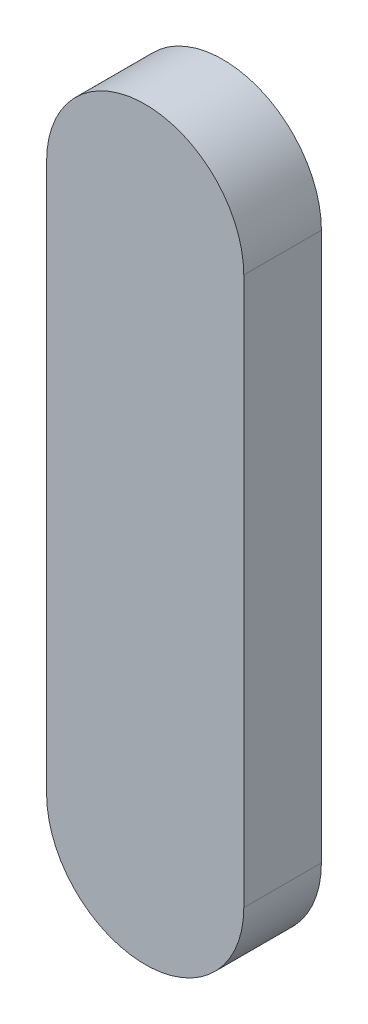
ISO-10303-21;
HEADER;
FILE_DESCRIPTION(('STEP AP214'),'2;1');
FILE_NAME('part.step','',(''),(''),'','','');
FILE_SCHEMA(('AUTOMOTIVE_DESIGN { 1 0 10303 214 1 1 1 1 }'));
ENDSEC;
DATA;
#1=APPLICATION_CONTEXT('core data for automotive mechanical design processes');
#2=APPLICATION_PROTOCOL_DEFINITION('international standard','automotive_design',2000,#1);
#3=PRODUCT_CONTEXT('',#1,'mechanical');
#4=PRODUCT('Part','Part','',(#3));
#5=PRODUCT_RELATED_PRODUCT_CATEGORY('part','',(#4));
#6=PRODUCT_DEFINITION_FORMATION('','',#4);
#7=PRODUCT_DEFINITION_CONTEXT('part definition',#1,'design');
#8=PRODUCT_DEFINITION('design','',#6,#7);
#9=PRODUCT_DEFINITION_SHAPE('','',#8);
#10=(LENGTH_UNIT() NAMED_UNIT(*) SI_UNIT(.MILLI.,.METRE.));
#11=(NAMED_UNIT(*) PLANE_ANGLE_UNIT() SI_UNIT($,.RADIAN.));
#12=(NAMED_UNIT(*) SI_UNIT($,.STERADIAN.) SOLID_ANGLE_UNIT());
#13=UNCERTAINTY_MEASURE_WITH_UNIT(LENGTH_MEASURE(1.E-05),#10,'distance_accuracy_value','');
#14=(GEOMETRIC_REPRESENTATION_CONTEXT(3) GLOBAL_UNCERTAINTY_ASSIGNED_CONTEXT((#13)) GLOBAL_UNIT_ASSIGNED_CONTEXT((#10,
#11,#12)) REPRESENTATION_CONTEXT('',''));
#15=CARTESIAN_POINT('',(0.,0.,0.));
#16=DIRECTION('',(0.,0.,1.));
#17=DIRECTION('',(1.,0.,0.));
#18=AXIS2_PLACEMENT_3D('',#15,#16,#17);
#19=CARTESIAN_POINT('',(151.6247412,76.6450588,0.));
#20=DIRECTION('',(-1.,0.,0.));
#21=DIRECTION('',(0.,1.,0.));
#22=AXIS2_PLACEMENT_3D('',#19,#20,#21);
#23=PLANE('',#22);
#24=DIRECTION('',(0.,1.,0.));
#25=VECTOR('',#24,1.);
#26=CARTESIAN_POINT('',(151.6247412,76.6450588,0.1999996));
#27=LINE('',#26,#25);
#28=CARTESIAN_POINT('',(151.6247412,76.6450588,0.1999996));
#29=VERTEX_POINT('',#28);
#30=CARTESIAN_POINT('',(151.6247412,78.0565876,0.1999996));
#31=VERTEX_POINT('',#30);
#32=EDGE_CURVE('E11',#29,#31,#27,.T.);
#33=ORIENTED_EDGE('',*,*,#32,.F.);
#34=DIRECTION('',(0.,0.,1.));
#35=VECTOR('',#34,1.);
#36=CARTESIAN_POINT('',(151.6247412,76.6450588,0.));
#37=LINE('',#36,#35);
#38=CARTESIAN_POINT('',(151.6247412,76.6450588,0.));
#39=VERTEX_POINT('',#38);
#40=EDGE_CURVE('E24',#39,#29,#37,.T.);
#41=ORIENTED_EDGE('',*,*,#40,.F.);
#42=DIRECTION('',(0.,1.,0.));
#43=VECTOR('',#42,1.);
#44=CARTESIAN_POINT('',(151.6247412,76.6450588,0.));
#45=LINE('',#44,#43);
#46=CARTESIAN_POINT('',(151.6247412,78.0565876,0.));
#47=VERTEX_POINT('',#46);
#48=EDGE_CURVE('E75',#39,#47,#45,.T.);
#49=ORIENTED_EDGE('',*,*,#48,.T.);
#50=DIRECTION('',(0.,0.,1.));
#51=VECTOR('',#50,1.);
#52=CARTESIAN_POINT('',(151.6247412,78.0565876,0.));
#53=LINE('',#52,#51);
#54=EDGE_CURVE('E37',#47,#31,#53,.T.);
#55=ORIENTED_EDGE('',*,*,#54,.T.);
#56=EDGE_LOOP('',(#33,#41,#49,#55));
#57=FACE_BOUND('',#56,.T.);
#58=ADVANCED_FACE('F17',(#57),#23,.F.);
#59=CARTESIAN_POINT('',(151.3707412,78.0565876,0.));
#60=DIRECTION('',(0.,0.,-1.));
#61=DIRECTION('',(1.,0.,0.));
#62=AXIS2_PLACEMENT_3D('',#59,#60,#61);
#63=CYLINDRICAL_SURFACE('',#62,0.254);
#64=CARTESIAN_POINT('',(151.3707412,78.0565876,0.1999996));
#65=DIRECTION('',(0.,0.,1.));
#66=DIRECTION('',(1.,0.,0.));
#67=AXIS2_PLACEMENT_3D('',#64,#65,#66);
#68=CIRCLE('',#67,0.254);
#69=CARTESIAN_POINT('',(151.1167412,78.0565876,0.1999996));
#70=VERTEX_POINT('',#69);
#71=EDGE_CURVE('E83',#31,#70,#68,.T.);
#72=ORIENTED_EDGE('',*,*,#71,.F.);
#73=ORIENTED_EDGE('',*,*,#54,.F.);
#74=CARTESIAN_POINT('',(151.3707412,78.0565876,0.));
#75=DIRECTION('',(0.,0.,1.));
#76=DIRECTION('',(1.,0.,0.));
#77=AXIS2_PLACEMENT_3D('',#74,#75,#76);
#78=CIRCLE('',#77,0.254);
#79=CARTESIAN_POINT('',(151.1167412,78.0565876,0.));
#80=VERTEX_POINT('',#79);
#81=EDGE_CURVE('E81',#47,#80,#78,.T.);
#82=ORIENTED_EDGE('',*,*,#81,.T.);
#83=DIRECTION('',(0.,0.,1.));
#84=VECTOR('',#83,1.);
#85=CARTESIAN_POINT('',(151.1167412,78.0565876,0.));
#86=LINE('',#85,#84);
#87=EDGE_CURVE('E67',#80,#70,#86,.T.);
#88=ORIENTED_EDGE('',*,*,#87,.T.);
#89=EDGE_LOOP('',(#72,#73,#82,#88));
#90=FACE_BOUND('',#89,.T.);
#91=ADVANCED_FACE('F89',(#90),#63,.T.);
#92=CARTESIAN_POINT('',(151.1167412,78.0565876,0.));
#93=DIRECTION('',(1.,0.,0.));
#94=DIRECTION('',(0.,-1.,0.));
#95=AXIS2_PLACEMENT_3D('',#92,#93,#94);
#96=PLANE('',#95);
#97=DIRECTION('',(0.,-1.,0.));
#98=VECTOR('',#97,1.);
#99=CARTESIAN_POINT('',(151.1167412,78.0565876,0.1999996));
#100=LINE('',#99,#98);
#101=CARTESIAN_POINT('',(151.1167412,76.6450588,0.1999996));
#102=VERTEX_POINT('',#101);
#103=EDGE_CURVE('E71',#70,#102,#100,.T.);
#104=ORIENTED_EDGE('',*,*,#103,.F.);
#105=ORIENTED_EDGE('',*,*,#87,.F.);
#106=DIRECTION('',(0.,-1.,0.));
#107=VECTOR('',#106,1.);
#108=CARTESIAN_POINT('',(151.1167412,78.0565876,0.));
#109=LINE('',#108,#107);
#110=CARTESIAN_POINT('',(151.1167412,76.6450588,0.));
#111=VERTEX_POINT('',#110);
#112=EDGE_CURVE('E63',#80,#111,#109,.T.);
#113=ORIENTED_EDGE('',*,*,#112,.T.);
#114=DIRECTION('',(0.,0.,1.));
#115=VECTOR('',#114,1.);
#116=CARTESIAN_POINT('',(151.1167412,76.6450588,0.));
#117=LINE('',#116,#115);
#118=EDGE_CURVE('E53',#111,#102,#117,.T.);
#119=ORIENTED_EDGE('',*,*,#118,.T.);
#120=EDGE_LOOP('',(#104,#105,#113,#119));
#121=FACE_BOUND('',#120,.T.);
#122=ADVANCED_FACE('F66',(#121),#96,.F.);
#123=CARTESIAN_POINT('',(151.3707412,76.6450588,0.));
#124=DIRECTION('',(0.,0.,-1.));
#125=DIRECTION('',(-1.,0.,0.));
#126=AXIS2_PLACEMENT_3D('',#123,#124,#125);
#127=CYLINDRICAL_SURFACE('',#126,0.254);
#128=CARTESIAN_POINT('',(151.3707412,76.6450588,0.1999996));
#129=DIRECTION('',(0.,0.,1.));
#130=DIRECTION('',(-1.,0.,0.));
#131=AXIS2_PLACEMENT_3D('',#128,#129,#130);
#132=CIRCLE('',#131,0.254);
#133=EDGE_CURVE('E59',#102,#29,#132,.T.);
#134=ORIENTED_EDGE('',*,*,#133,.F.);
#135=ORIENTED_EDGE('',*,*,#118,.F.);
#136=CARTESIAN_POINT('',(151.3707412,76.6450588,0.));
#137=DIRECTION('',(0.,0.,1.));
#138=DIRECTION('',(-1.,0.,0.));
#139=AXIS2_PLACEMENT_3D('',#136,#137,#138);
#140=CIRCLE('',#139,0.254);
#141=EDGE_CURVE('E57',#111,#39,#140,.T.);
#142=ORIENTED_EDGE('',*,*,#141,.T.);
#143=ORIENTED_EDGE('',*,*,#40,.T.);
#144=EDGE_LOOP('',(#134,#135,#142,#143));
#145=FACE_BOUND('',#144,.T.);
#146=ADVANCED_FACE('F55',(#145),#127,.T.);
#147=CARTESIAN_POINT('',(151.6247412,76.6450588,0.));
#148=DIRECTION('',(0.,0.,-1.));
#149=DIRECTION('',(-1.,0.,0.));
#150=AXIS2_PLACEMENT_3D('',#147,#148,#149);
#151=PLANE('',#150);
#152=ORIENTED_EDGE('',*,*,#141,.F.);
#153=ORIENTED_EDGE('',*,*,#112,.F.);
#154=ORIENTED_EDGE('',*,*,#81,.F.);
#155=ORIENTED_EDGE('',*,*,#48,.F.);
#156=EDGE_LOOP('',(#152,#153,#154,#155));
#157=FACE_BOUND('',#156,.T.);
#158=ADVANCED_FACE('F74',(#157),#151,.T.);
#159=CARTESIAN_POINT('',(151.6247412,76.6450588,0.1999996));
#160=DIRECTION('',(0.,0.,-1.));
#161=DIRECTION('',(-1.,0.,0.));
#162=AXIS2_PLACEMENT_3D('',#159,#160,#161);
#163=PLANE('',#162);
#164=ORIENTED_EDGE('',*,*,#32,.T.);
#165=ORIENTED_EDGE('',*,*,#71,.T.);
#166=ORIENTED_EDGE('',*,*,#103,.T.);
#167=ORIENTED_EDGE('',*,*,#133,.T.);
#168=EDGE_LOOP('',(#164,#165,#166,#167));
#169=FACE_BOUND('',#168,.T.);
#170=ADVANCED_FACE('F91',(#169),#163,.F.);
#171=CLOSED_SHELL('',(#58,#91,#122,#146,#158,#170));
#172=MANIFOLD_SOLID_BREP('B1',#171);
#173=ADVANCED_BREP_SHAPE_REPRESENTATION('',(#18,#172),#14);
#174=SHAPE_DEFINITION_REPRESENTATION(#9,#173);
ENDSEC;
END-ISO-10303-21;
